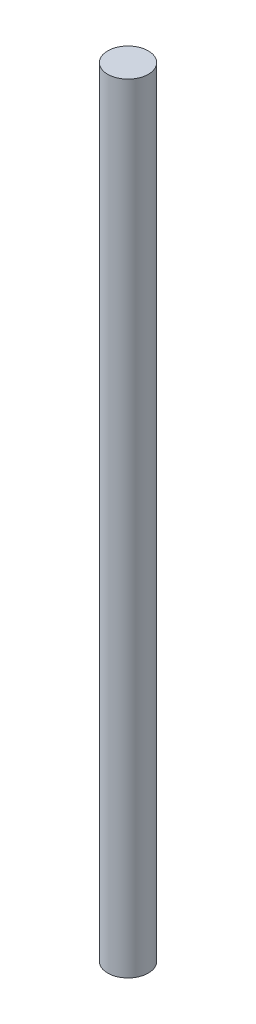
ISO-10303-21;
HEADER;
FILE_DESCRIPTION(('STEP AP214'),'2;1');
FILE_NAME('part.step','',(''),(''),'','','');
FILE_SCHEMA(('AUTOMOTIVE_DESIGN { 1 0 10303 214 1 1 1 1 }'));
ENDSEC;
DATA;
#1=APPLICATION_CONTEXT('core data for automotive mechanical design processes');
#2=APPLICATION_PROTOCOL_DEFINITION('international standard','automotive_design',2000,#1);
#3=PRODUCT_CONTEXT('',#1,'mechanical');
#4=PRODUCT('Part','Part','',(#3));
#5=PRODUCT_RELATED_PRODUCT_CATEGORY('part','',(#4));
#6=PRODUCT_DEFINITION_FORMATION('','',#4);
#7=PRODUCT_DEFINITION_CONTEXT('part definition',#1,'design');
#8=PRODUCT_DEFINITION('design','',#6,#7);
#9=PRODUCT_DEFINITION_SHAPE('','',#8);
#10=(LENGTH_UNIT() NAMED_UNIT(*) SI_UNIT(.MILLI.,.METRE.));
#11=(NAMED_UNIT(*) PLANE_ANGLE_UNIT() SI_UNIT($,.RADIAN.));
#12=(NAMED_UNIT(*) SI_UNIT($,.STERADIAN.) SOLID_ANGLE_UNIT());
#13=UNCERTAINTY_MEASURE_WITH_UNIT(LENGTH_MEASURE(1.E-05),#10,'distance_accuracy_value','');
#14=(GEOMETRIC_REPRESENTATION_CONTEXT(3) GLOBAL_UNCERTAINTY_ASSIGNED_CONTEXT((#13)) GLOBAL_UNIT_ASSIGNED_CONTEXT((#10,
#11,#12)) REPRESENTATION_CONTEXT('',''));
#15=CARTESIAN_POINT('',(0.,0.,0.));
#16=DIRECTION('',(0.,0.,1.));
#17=DIRECTION('',(1.,0.,0.));
#18=AXIS2_PLACEMENT_3D('',#15,#16,#17);
#19=CARTESIAN_POINT('',(0.,230.,0.));
#20=DIRECTION('',(0.,1.,0.));
#21=DIRECTION('',(0.,0.,1.));
#22=AXIS2_PLACEMENT_3D('',#19,#20,#21);
#23=PLANE('',#22);
#24=CARTESIAN_POINT('',(0.,230.,0.));
#25=DIRECTION('',(0.,-1.,0.));
#26=DIRECTION('',(0.,0.,-1.));
#27=AXIS2_PLACEMENT_3D('',#24,#25,#26);
#28=CIRCLE('',#27,6.);
#29=CARTESIAN_POINT('',(0.,230.,-6.));
#30=VERTEX_POINT('',#29);
#31=EDGE_CURVE('E18',#30,#30,#28,.T.);
#32=ORIENTED_EDGE('',*,*,#31,.F.);
#33=EDGE_LOOP('',(#32));
#34=FACE_BOUND('',#33,.T.);
#35=ADVANCED_FACE('F15',(#34),#23,.T.);
#36=CARTESIAN_POINT('',(0.,0.,0.));
#37=DIRECTION('',(0.,1.,0.));
#38=DIRECTION('',(0.,0.,1.));
#39=AXIS2_PLACEMENT_3D('',#36,#37,#38);
#40=PLANE('',#39);
#41=CARTESIAN_POINT('',(0.,0.,0.));
#42=DIRECTION('',(0.,-1.,0.));
#43=DIRECTION('',(0.,0.,-1.));
#44=AXIS2_PLACEMENT_3D('',#41,#42,#43);
#45=CIRCLE('',#44,6.);
#46=CARTESIAN_POINT('',(0.,0.,-6.));
#47=VERTEX_POINT('',#46);
#48=EDGE_CURVE('E10',#47,#47,#45,.F.);
#49=ORIENTED_EDGE('',*,*,#48,.F.);
#50=EDGE_LOOP('',(#49));
#51=FACE_BOUND('',#50,.T.);
#52=ADVANCED_FACE('F30',(#51),#40,.F.);
#53=CARTESIAN_POINT('',(0.,230.,0.));
#54=DIRECTION('',(0.,-1.,0.));
#55=DIRECTION('',(0.,0.,-1.));
#56=AXIS2_PLACEMENT_3D('',#53,#54,#55);
#57=CYLINDRICAL_SURFACE('',#56,6.);
#58=ORIENTED_EDGE('',*,*,#48,.T.);
#59=EDGE_LOOP('',(#58));
#60=FACE_BOUND('',#59,.T.);
#61=ORIENTED_EDGE('',*,*,#31,.T.);
#62=EDGE_LOOP('',(#61));
#63=FACE_BOUND('',#62,.T.);
#64=ADVANCED_FACE('F27',(#60,#63),#57,.T.);
#65=CLOSED_SHELL('',(#35,#52,#64));
#66=MANIFOLD_SOLID_BREP('B1',#65);
#67=ADVANCED_BREP_SHAPE_REPRESENTATION('',(#18,#66),#14);
#68=SHAPE_DEFINITION_REPRESENTATION(#9,#67);
ENDSEC;
END-ISO-10303-21;
